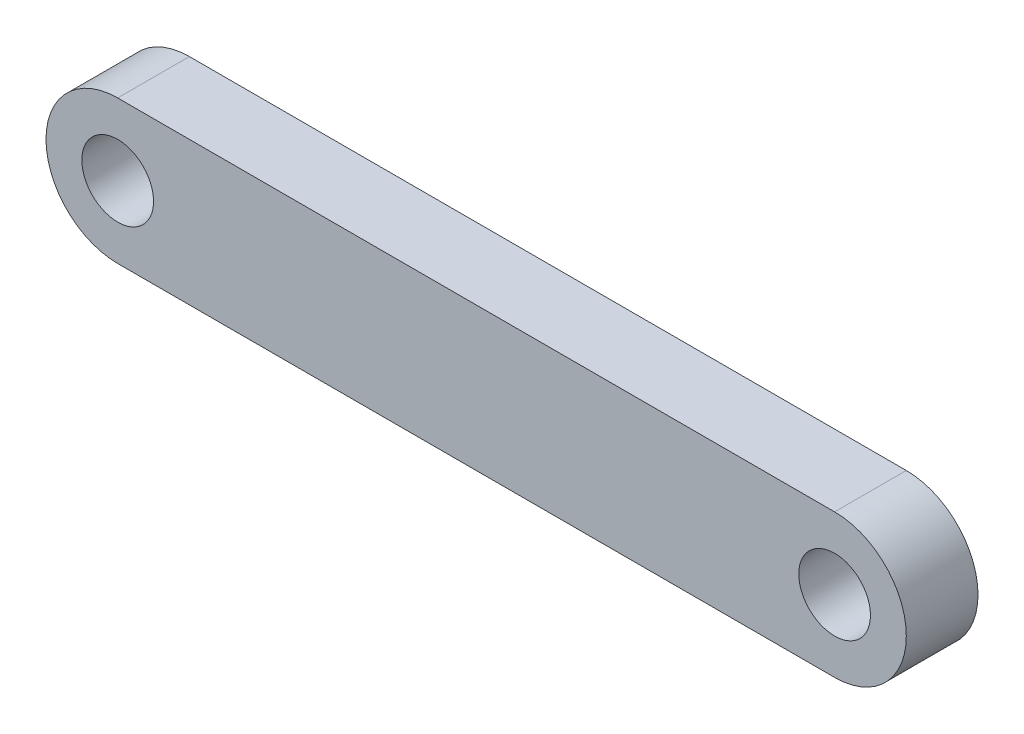
ISO-10303-21;
HEADER;
FILE_DESCRIPTION(('STEP AP214'),'2;1');
FILE_NAME('part.step','',(''),(''),'','','');
FILE_SCHEMA(('AUTOMOTIVE_DESIGN { 1 0 10303 214 1 1 1 1 }'));
ENDSEC;
DATA;
#1=APPLICATION_CONTEXT('core data for automotive mechanical design processes');
#2=APPLICATION_PROTOCOL_DEFINITION('international standard','automotive_design',2000,#1);
#3=PRODUCT_CONTEXT('',#1,'mechanical');
#4=PRODUCT('Part','Part','',(#3));
#5=PRODUCT_RELATED_PRODUCT_CATEGORY('part','',(#4));
#6=PRODUCT_DEFINITION_FORMATION('','',#4);
#7=PRODUCT_DEFINITION_CONTEXT('part definition',#1,'design');
#8=PRODUCT_DEFINITION('design','',#6,#7);
#9=PRODUCT_DEFINITION_SHAPE('','',#8);
#10=(LENGTH_UNIT() NAMED_UNIT(*) SI_UNIT(.MILLI.,.METRE.));
#11=(NAMED_UNIT(*) PLANE_ANGLE_UNIT() SI_UNIT($,.RADIAN.));
#12=(NAMED_UNIT(*) SI_UNIT($,.STERADIAN.) SOLID_ANGLE_UNIT());
#13=UNCERTAINTY_MEASURE_WITH_UNIT(LENGTH_MEASURE(1.E-05),#10,'distance_accuracy_value','');
#14=(GEOMETRIC_REPRESENTATION_CONTEXT(3) GLOBAL_UNCERTAINTY_ASSIGNED_CONTEXT((#13)) GLOBAL_UNIT_ASSIGNED_CONTEXT((#10,
#11,#12)) REPRESENTATION_CONTEXT('',''));
#15=CARTESIAN_POINT('',(0.,0.,0.));
#16=DIRECTION('',(0.,0.,1.));
#17=DIRECTION('',(1.,0.,0.));
#18=AXIS2_PLACEMENT_3D('',#15,#16,#17);
#19=CARTESIAN_POINT('',(-50.,0.,10.));
#20=DIRECTION('',(0.,0.,1.));
#21=DIRECTION('',(1.,0.,0.));
#22=AXIS2_PLACEMENT_3D('',#19,#20,#21);
#23=PLANE('',#22);
#24=CARTESIAN_POINT('',(50.,0.,10.));
#25=DIRECTION('',(0.,0.,1.));
#26=DIRECTION('',(1.,0.,0.));
#27=AXIS2_PLACEMENT_3D('',#24,#25,#26);
#28=CIRCLE('',#27,5.);
#29=CARTESIAN_POINT('',(55.,0.,10.));
#30=VERTEX_POINT('',#29);
#31=EDGE_CURVE('E102',#30,#30,#28,.T.);
#32=ORIENTED_EDGE('',*,*,#31,.F.);
#33=EDGE_LOOP('',(#32));
#34=FACE_BOUND('',#33,.T.);
#35=CARTESIAN_POINT('',(-50.,0.,10.));
#36=DIRECTION('',(0.,0.,1.));
#37=DIRECTION('',(1.,0.,0.));
#38=AXIS2_PLACEMENT_3D('',#35,#36,#37);
#39=CIRCLE('',#38,10.);
#40=CARTESIAN_POINT('',(-50.,9.99999999999999,10.));
#41=VERTEX_POINT('',#40);
#42=CARTESIAN_POINT('',(-50.,-10.,10.));
#43=VERTEX_POINT('',#42);
#44=EDGE_CURVE('E87',#41,#43,#39,.T.);
#45=ORIENTED_EDGE('',*,*,#44,.T.);
#46=DIRECTION('',(1.,0.,0.));
#47=VECTOR('',#46,1.);
#48=CARTESIAN_POINT('',(-50.,-10.,10.));
#49=LINE('',#48,#47);
#50=CARTESIAN_POINT('',(50.,-10.,10.));
#51=VERTEX_POINT('',#50);
#52=EDGE_CURVE('E82',#43,#51,#49,.T.);
#53=ORIENTED_EDGE('',*,*,#52,.T.);
#54=CARTESIAN_POINT('',(50.,0.,10.));
#55=DIRECTION('',(0.,0.,1.));
#56=DIRECTION('',(1.,0.,0.));
#57=AXIS2_PLACEMENT_3D('',#54,#55,#56);
#58=CIRCLE('',#57,10.);
#59=CARTESIAN_POINT('',(50.,10.,10.));
#60=VERTEX_POINT('',#59);
#61=EDGE_CURVE('E85',#51,#60,#58,.T.);
#62=ORIENTED_EDGE('',*,*,#61,.T.);
#63=DIRECTION('',(-1.,0.,0.));
#64=VECTOR('',#63,1.);
#65=CARTESIAN_POINT('',(-50.,9.99999999999999,10.));
#66=LINE('',#65,#64);
#67=EDGE_CURVE('E52',#60,#41,#66,.T.);
#68=ORIENTED_EDGE('',*,*,#67,.T.);
#69=EDGE_LOOP('',(#45,#53,#62,#68));
#70=FACE_BOUND('',#69,.T.);
#71=CARTESIAN_POINT('',(-50.,0.,10.));
#72=DIRECTION('',(0.,0.,1.));
#73=DIRECTION('',(-1.,0.,0.));
#74=AXIS2_PLACEMENT_3D('',#71,#72,#73);
#75=CIRCLE('',#74,5.);
#76=CARTESIAN_POINT('',(-55.,0.,10.));
#77=VERTEX_POINT('',#76);
#78=EDGE_CURVE('E117',#77,#77,#75,.T.);
#79=ORIENTED_EDGE('',*,*,#78,.F.);
#80=EDGE_LOOP('',(#79));
#81=FACE_BOUND('',#80,.T.);
#82=ADVANCED_FACE('F35',(#34,#70,#81),#23,.T.);
#83=CARTESIAN_POINT('',(-50.,0.,0.));
#84=DIRECTION('',(0.,0.,1.));
#85=DIRECTION('',(1.,0.,0.));
#86=AXIS2_PLACEMENT_3D('',#83,#84,#85);
#87=PLANE('',#86);
#88=CARTESIAN_POINT('',(-50.,0.,0.));
#89=DIRECTION('',(0.,0.,1.));
#90=DIRECTION('',(1.,0.,0.));
#91=AXIS2_PLACEMENT_3D('',#88,#89,#90);
#92=CIRCLE('',#91,10.);
#93=CARTESIAN_POINT('',(-50.,9.99999999999999,0.));
#94=VERTEX_POINT('',#93);
#95=CARTESIAN_POINT('',(-50.,-10.,0.));
#96=VERTEX_POINT('',#95);
#97=EDGE_CURVE('E99',#94,#96,#92,.T.);
#98=ORIENTED_EDGE('',*,*,#97,.F.);
#99=DIRECTION('',(-1.,0.,0.));
#100=VECTOR('',#99,1.);
#101=CARTESIAN_POINT('',(-50.,9.99999999999999,0.));
#102=LINE('',#101,#100);
#103=CARTESIAN_POINT('',(50.,10.,0.));
#104=VERTEX_POINT('',#103);
#105=EDGE_CURVE('E75',#104,#94,#102,.T.);
#106=ORIENTED_EDGE('',*,*,#105,.F.);
#107=CARTESIAN_POINT('',(50.,0.,0.));
#108=DIRECTION('',(0.,0.,1.));
#109=DIRECTION('',(1.,0.,0.));
#110=AXIS2_PLACEMENT_3D('',#107,#108,#109);
#111=CIRCLE('',#110,10.);
#112=CARTESIAN_POINT('',(50.,-10.,0.));
#113=VERTEX_POINT('',#112);
#114=EDGE_CURVE('E69',#113,#104,#111,.T.);
#115=ORIENTED_EDGE('',*,*,#114,.F.);
#116=DIRECTION('',(1.,0.,0.));
#117=VECTOR('',#116,1.);
#118=CARTESIAN_POINT('',(-50.,-10.,0.));
#119=LINE('',#118,#117);
#120=EDGE_CURVE('E91',#96,#113,#119,.T.);
#121=ORIENTED_EDGE('',*,*,#120,.F.);
#122=EDGE_LOOP('',(#98,#106,#115,#121));
#123=FACE_BOUND('',#122,.T.);
#124=CARTESIAN_POINT('',(50.,0.,0.));
#125=DIRECTION('',(0.,0.,1.));
#126=DIRECTION('',(1.,0.,0.));
#127=AXIS2_PLACEMENT_3D('',#124,#125,#126);
#128=CIRCLE('',#127,5.);
#129=CARTESIAN_POINT('',(55.,0.,0.));
#130=VERTEX_POINT('',#129);
#131=EDGE_CURVE('E114',#130,#130,#128,.T.);
#132=ORIENTED_EDGE('',*,*,#131,.T.);
#133=EDGE_LOOP('',(#132));
#134=FACE_BOUND('',#133,.T.);
#135=CARTESIAN_POINT('',(-50.,0.,0.));
#136=DIRECTION('',(0.,0.,1.));
#137=DIRECTION('',(-1.,0.,0.));
#138=AXIS2_PLACEMENT_3D('',#135,#136,#137);
#139=CIRCLE('',#138,5.);
#140=CARTESIAN_POINT('',(-55.,0.,0.));
#141=VERTEX_POINT('',#140);
#142=EDGE_CURVE('E120',#141,#141,#139,.T.);
#143=ORIENTED_EDGE('',*,*,#142,.T.);
#144=EDGE_LOOP('',(#143));
#145=FACE_BOUND('',#144,.T.);
#146=ADVANCED_FACE('F110',(#123,#134,#145),#87,.F.);
#147=CARTESIAN_POINT('',(-50.,0.,10.));
#148=DIRECTION('',(0.,0.,-1.));
#149=DIRECTION('',(-1.,0.,0.));
#150=AXIS2_PLACEMENT_3D('',#147,#148,#149);
#151=CYLINDRICAL_SURFACE('',#150,10.);
#152=ORIENTED_EDGE('',*,*,#97,.T.);
#153=DIRECTION('',(0.,0.,-1.));
#154=VECTOR('',#153,1.);
#155=CARTESIAN_POINT('',(-50.,-10.,10.));
#156=LINE('',#155,#154);
#157=EDGE_CURVE('E11',#43,#96,#156,.T.);
#158=ORIENTED_EDGE('',*,*,#157,.F.);
#159=ORIENTED_EDGE('',*,*,#44,.F.);
#160=DIRECTION('',(0.,0.,-1.));
#161=VECTOR('',#160,1.);
#162=CARTESIAN_POINT('',(-50.,9.99999999999999,10.));
#163=LINE('',#162,#161);
#164=EDGE_CURVE('E95',#41,#94,#163,.T.);
#165=ORIENTED_EDGE('',*,*,#164,.T.);
#166=EDGE_LOOP('',(#152,#158,#159,#165));
#167=FACE_BOUND('',#166,.T.);
#168=ADVANCED_FACE('F37',(#167),#151,.T.);
#169=CARTESIAN_POINT('',(-50.,-10.,10.));
#170=DIRECTION('',(0.,1.,0.));
#171=DIRECTION('',(-1.,0.,0.));
#172=AXIS2_PLACEMENT_3D('',#169,#170,#171);
#173=PLANE('',#172);
#174=ORIENTED_EDGE('',*,*,#120,.T.);
#175=DIRECTION('',(0.,0.,-1.));
#176=VECTOR('',#175,1.);
#177=CARTESIAN_POINT('',(50.,-10.,10.));
#178=LINE('',#177,#176);
#179=EDGE_CURVE('E44',#51,#113,#178,.T.);
#180=ORIENTED_EDGE('',*,*,#179,.F.);
#181=ORIENTED_EDGE('',*,*,#52,.F.);
#182=ORIENTED_EDGE('',*,*,#157,.T.);
#183=EDGE_LOOP('',(#174,#180,#181,#182));
#184=FACE_BOUND('',#183,.T.);
#185=ADVANCED_FACE('F90',(#184),#173,.F.);
#186=CARTESIAN_POINT('',(50.,0.,10.));
#187=DIRECTION('',(0.,0.,-1.));
#188=DIRECTION('',(-1.,0.,0.));
#189=AXIS2_PLACEMENT_3D('',#186,#187,#188);
#190=CYLINDRICAL_SURFACE('',#189,10.);
#191=ORIENTED_EDGE('',*,*,#114,.T.);
#192=DIRECTION('',(0.,0.,-1.));
#193=VECTOR('',#192,1.);
#194=CARTESIAN_POINT('',(50.,10.,10.));
#195=LINE('',#194,#193);
#196=EDGE_CURVE('E92',#60,#104,#195,.T.);
#197=ORIENTED_EDGE('',*,*,#196,.F.);
#198=ORIENTED_EDGE('',*,*,#61,.F.);
#199=ORIENTED_EDGE('',*,*,#179,.T.);
#200=EDGE_LOOP('',(#191,#197,#198,#199));
#201=FACE_BOUND('',#200,.T.);
#202=ADVANCED_FACE('F93',(#201),#190,.T.);
#203=CARTESIAN_POINT('',(-50.,9.99999999999999,10.));
#204=DIRECTION('',(0.,-1.,0.));
#205=DIRECTION('',(1.,0.,0.));
#206=AXIS2_PLACEMENT_3D('',#203,#204,#205);
#207=PLANE('',#206);
#208=ORIENTED_EDGE('',*,*,#105,.T.);
#209=ORIENTED_EDGE('',*,*,#164,.F.);
#210=ORIENTED_EDGE('',*,*,#67,.F.);
#211=ORIENTED_EDGE('',*,*,#196,.T.);
#212=EDGE_LOOP('',(#208,#209,#210,#211));
#213=FACE_BOUND('',#212,.T.);
#214=ADVANCED_FACE('F107',(#213),#207,.F.);
#215=CARTESIAN_POINT('',(50.,0.,10.));
#216=DIRECTION('',(0.,0.,-1.));
#217=DIRECTION('',(-1.,0.,0.));
#218=AXIS2_PLACEMENT_3D('',#215,#216,#217);
#219=CYLINDRICAL_SURFACE('',#218,5.);
#220=ORIENTED_EDGE('',*,*,#31,.T.);
#221=EDGE_LOOP('',(#220));
#222=FACE_BOUND('',#221,.T.);
#223=ORIENTED_EDGE('',*,*,#131,.F.);
#224=EDGE_LOOP('',(#223));
#225=FACE_BOUND('',#224,.T.);
#226=ADVANCED_FACE('F137',(#222,#225),#219,.F.);
#227=CARTESIAN_POINT('',(-50.,0.,10.));
#228=DIRECTION('',(0.,0.,-1.));
#229=DIRECTION('',(-1.,0.,0.));
#230=AXIS2_PLACEMENT_3D('',#227,#228,#229);
#231=CYLINDRICAL_SURFACE('',#230,5.);
#232=ORIENTED_EDGE('',*,*,#78,.T.);
#233=EDGE_LOOP('',(#232));
#234=FACE_BOUND('',#233,.T.);
#235=ORIENTED_EDGE('',*,*,#142,.F.);
#236=EDGE_LOOP('',(#235));
#237=FACE_BOUND('',#236,.T.);
#238=ADVANCED_FACE('F126',(#234,#237),#231,.F.);
#239=CLOSED_SHELL('',(#82,#146,#168,#185,#202,#214,#226,#238));
#240=MANIFOLD_SOLID_BREP('B2',#239);
#241=ADVANCED_BREP_SHAPE_REPRESENTATION('',(#18,#240),#14);
#242=SHAPE_DEFINITION_REPRESENTATION(#9,#241);
ENDSEC;
END-ISO-10303-21;
